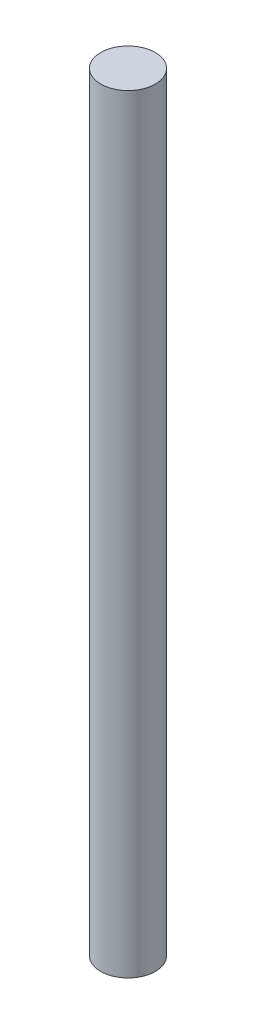
ISO-10303-21;
HEADER;
FILE_DESCRIPTION(('STEP AP214'),'2;1');
FILE_NAME('part.step','',(''),(''),'','','');
FILE_SCHEMA(('AUTOMOTIVE_DESIGN { 1 0 10303 214 1 1 1 1 }'));
ENDSEC;
DATA;
#1=APPLICATION_CONTEXT('core data for automotive mechanical design processes');
#2=APPLICATION_PROTOCOL_DEFINITION('international standard','automotive_design',2000,#1);
#3=PRODUCT_CONTEXT('',#1,'mechanical');
#4=PRODUCT('Part','Part','',(#3));
#5=PRODUCT_RELATED_PRODUCT_CATEGORY('part','',(#4));
#6=PRODUCT_DEFINITION_FORMATION('','',#4);
#7=PRODUCT_DEFINITION_CONTEXT('part definition',#1,'design');
#8=PRODUCT_DEFINITION('design','',#6,#7);
#9=PRODUCT_DEFINITION_SHAPE('','',#8);
#10=(LENGTH_UNIT() NAMED_UNIT(*) SI_UNIT(.MILLI.,.METRE.));
#11=(NAMED_UNIT(*) PLANE_ANGLE_UNIT() SI_UNIT($,.RADIAN.));
#12=(NAMED_UNIT(*) SI_UNIT($,.STERADIAN.) SOLID_ANGLE_UNIT());
#13=UNCERTAINTY_MEASURE_WITH_UNIT(LENGTH_MEASURE(1.E-05),#10,'distance_accuracy_value','');
#14=(GEOMETRIC_REPRESENTATION_CONTEXT(3) GLOBAL_UNCERTAINTY_ASSIGNED_CONTEXT((#13)) GLOBAL_UNIT_ASSIGNED_CONTEXT((#10,
#11,#12)) REPRESENTATION_CONTEXT('',''));
#15=CARTESIAN_POINT('',(0.,0.,0.));
#16=DIRECTION('',(0.,0.,1.));
#17=DIRECTION('',(1.,0.,0.));
#18=AXIS2_PLACEMENT_3D('',#15,#16,#17);
#19=CARTESIAN_POINT('',(0.,45.,0.));
#20=DIRECTION('',(0.,-1.,0.));
#21=DIRECTION('',(0.,0.,-1.));
#22=AXIS2_PLACEMENT_3D('',#19,#20,#21);
#23=CYLINDRICAL_SURFACE('',#22,1.6);
#24=CARTESIAN_POINT('',(0.,45.,0.));
#25=DIRECTION('',(0.,1.,0.));
#26=DIRECTION('',(0.,0.,1.));
#27=AXIS2_PLACEMENT_3D('',#24,#25,#26);
#28=CIRCLE('',#27,1.6);
#29=CARTESIAN_POINT('',(0.,45.,-1.6));
#30=VERTEX_POINT('',#29);
#31=EDGE_CURVE('E10',#30,#30,#28,.T.);
#32=CARTESIAN_POINT('',(0.,0.,0.));
#33=DIRECTION('',(0.,1.,0.));
#34=DIRECTION('',(0.,0.,1.));
#35=AXIS2_PLACEMENT_3D('',#32,#33,#34);
#36=CIRCLE('',#35,1.6);
#37=CARTESIAN_POINT('',(0.,0.,-1.6));
#38=VERTEX_POINT('',#37);
#39=EDGE_CURVE('E46',#38,#38,#36,.T.);
#40=CARTESIAN_POINT('',(0.,45.,-1.6));
#41=CARTESIAN_POINT('',(0.,44.53125,-1.6));
#42=CARTESIAN_POINT('',(0.,44.0625,-1.6));
#43=CARTESIAN_POINT('',(0.,43.125,-1.6));
#44=CARTESIAN_POINT('',(0.,42.65625,-1.6));
#45=CARTESIAN_POINT('',(0.,41.71875,-1.6));
#46=CARTESIAN_POINT('',(0.,41.25,-1.6));
#47=CARTESIAN_POINT('',(0.,40.3125,-1.6));
#48=CARTESIAN_POINT('',(0.,39.84375,-1.6));
#49=CARTESIAN_POINT('',(0.,38.90625,-1.6));
#50=CARTESIAN_POINT('',(0.,38.4375,-1.6));
#51=CARTESIAN_POINT('',(0.,37.5,-1.6));
#52=CARTESIAN_POINT('',(0.,37.03125,-1.6));
#53=CARTESIAN_POINT('',(0.,36.09375,-1.6));
#54=CARTESIAN_POINT('',(0.,35.625,-1.6));
#55=CARTESIAN_POINT('',(0.,34.6875,-1.6));
#56=CARTESIAN_POINT('',(0.,34.21875,-1.6));
#57=CARTESIAN_POINT('',(0.,33.28125,-1.6));
#58=CARTESIAN_POINT('',(0.,32.8125,-1.6));
#59=CARTESIAN_POINT('',(0.,31.875,-1.6));
#60=CARTESIAN_POINT('',(0.,31.40625,-1.6));
#61=CARTESIAN_POINT('',(0.,30.46875,-1.6));
#62=CARTESIAN_POINT('',(0.,30.,-1.6));
#63=CARTESIAN_POINT('',(0.,29.0625,-1.6));
#64=CARTESIAN_POINT('',(0.,28.59375,-1.6));
#65=CARTESIAN_POINT('',(0.,27.65625,-1.6));
#66=CARTESIAN_POINT('',(0.,27.1875,-1.6));
#67=CARTESIAN_POINT('',(0.,26.25,-1.6));
#68=CARTESIAN_POINT('',(0.,25.78125,-1.6));
#69=CARTESIAN_POINT('',(0.,24.84375,-1.6));
#70=CARTESIAN_POINT('',(0.,24.375,-1.6));
#71=CARTESIAN_POINT('',(0.,23.4375,-1.6));
#72=CARTESIAN_POINT('',(0.,22.96875,-1.6));
#73=CARTESIAN_POINT('',(0.,22.03125,-1.6));
#74=CARTESIAN_POINT('',(0.,21.5625,-1.6));
#75=CARTESIAN_POINT('',(0.,20.625,-1.6));
#76=CARTESIAN_POINT('',(0.,20.15625,-1.6));
#77=CARTESIAN_POINT('',(0.,19.21875,-1.6));
#78=CARTESIAN_POINT('',(0.,18.75,-1.6));
#79=CARTESIAN_POINT('',(0.,17.8125,-1.6));
#80=CARTESIAN_POINT('',(0.,17.34375,-1.6));
#81=CARTESIAN_POINT('',(0.,16.40625,-1.6));
#82=CARTESIAN_POINT('',(0.,15.9375,-1.6));
#83=CARTESIAN_POINT('',(0.,15.,-1.6));
#84=CARTESIAN_POINT('',(0.,14.53125,-1.6));
#85=CARTESIAN_POINT('',(0.,13.59375,-1.6));
#86=CARTESIAN_POINT('',(0.,13.125,-1.6));
#87=CARTESIAN_POINT('',(0.,12.1875,-1.6));
#88=CARTESIAN_POINT('',(0.,11.71875,-1.6));
#89=CARTESIAN_POINT('',(0.,10.78125,-1.6));
#90=CARTESIAN_POINT('',(0.,10.3125,-1.6));
#91=CARTESIAN_POINT('',(0.,9.375,-1.6));
#92=CARTESIAN_POINT('',(0.,8.90625,-1.6));
#93=CARTESIAN_POINT('',(0.,7.96874999999999,-1.6));
#94=CARTESIAN_POINT('',(0.,7.5,-1.6));
#95=CARTESIAN_POINT('',(0.,6.5625,-1.6));
#96=CARTESIAN_POINT('',(0.,6.09375,-1.6));
#97=CARTESIAN_POINT('',(0.,5.15625,-1.6));
#98=CARTESIAN_POINT('',(0.,4.68749999999999,-1.6));
#99=CARTESIAN_POINT('',(0.,3.74999999999999,-1.6));
#100=CARTESIAN_POINT('',(0.,3.28124999999999,-1.6));
#101=CARTESIAN_POINT('',(0.,2.34374999999999,-1.6));
#102=CARTESIAN_POINT('',(0.,1.87499999999999,-1.6));
#103=CARTESIAN_POINT('',(0.,0.937499999999992,-1.6));
#104=CARTESIAN_POINT('',(0.,0.468749999999993,-1.6));
#105=CARTESIAN_POINT('',(0.,0.,-1.6));
#106=B_SPLINE_CURVE_WITH_KNOTS('',3,(#40,#41,#42,#43,#44,#45,#46,#47,#48,#49,#50,#51,#52,#53,
#54,#55,#56,#57,#58,#59,#60,#61,#62,#63,#64,#65,#66,#67,#68,#69,#70,#71,#72,#73,#74,#75,#76,#77,
#78,#79,#80,#81,#82,#83,#84,#85,#86,#87,#88,#89,#90,#91,#92,#93,#94,#95,#96,#97,#98,#99,#100,
#101,#102,#103,#104,#105),.UNSPECIFIED.,.F.,.F.,(4,2,2,2,2,2,2,2,2,2,2,2,2,2,2,2,2,2,2,2,2,2,2,
2,2,2,2,2,2,2,2,2,4),(0.,1.40625,2.8125,4.21875000000001,5.62500000000001,7.03125,8.4375,
9.84375000000001,11.25,12.65625,14.0625,15.46875,16.875,18.28125,19.6875,21.09375,22.5,23.90625,
25.3125,26.71875,28.125,29.53125,30.9375,32.34375,33.75,35.15625,36.5625,37.96875,39.375,
40.78125,42.1875,43.59375,45.),.UNSPECIFIED.);
#107=EDGE_CURVE('BSEAM43',#30,#38,#106,.T.);
#108=ORIENTED_EDGE('',*,*,#31,.F.);
#109=ORIENTED_EDGE('',*,*,#39,.T.);
#110=ORIENTED_EDGE('',*,*,#107,.T.);
#111=ORIENTED_EDGE('',*,*,#107,.F.);
#112=EDGE_LOOP('',(#108,#110,#109,#111));
#113=FACE_BOUND('',#112,.T.);
#114=ADVANCED_FACE('F43',(#113),#23,.T.);
#115=CARTESIAN_POINT('',(0.,45.,0.));
#116=DIRECTION('',(0.,1.,0.));
#117=DIRECTION('',(0.,0.,1.));
#118=AXIS2_PLACEMENT_3D('',#115,#116,#117);
#119=PLANE('',#118);
#120=ORIENTED_EDGE('',*,*,#31,.T.);
#121=EDGE_LOOP('',(#120));
#122=FACE_BOUND('',#121,.T.);
#123=ADVANCED_FACE('F60',(#122),#119,.T.);
#124=CARTESIAN_POINT('',(0.,0.,0.));
#125=DIRECTION('',(0.,1.,0.));
#126=DIRECTION('',(0.,0.,1.));
#127=AXIS2_PLACEMENT_3D('',#124,#125,#126);
#128=PLANE('',#127);
#129=ORIENTED_EDGE('',*,*,#39,.F.);
#130=EDGE_LOOP('',(#129));
#131=FACE_BOUND('',#130,.T.);
#132=ADVANCED_FACE('F58',(#131),#128,.F.);
#133=CLOSED_SHELL('',(#114,#123,#132));
#134=MANIFOLD_SOLID_BREP('B2',#133);
#135=ADVANCED_BREP_SHAPE_REPRESENTATION('',(#18,#134),#14);
#136=SHAPE_DEFINITION_REPRESENTATION(#9,#135);
ENDSEC;
END-ISO-10303-21;
